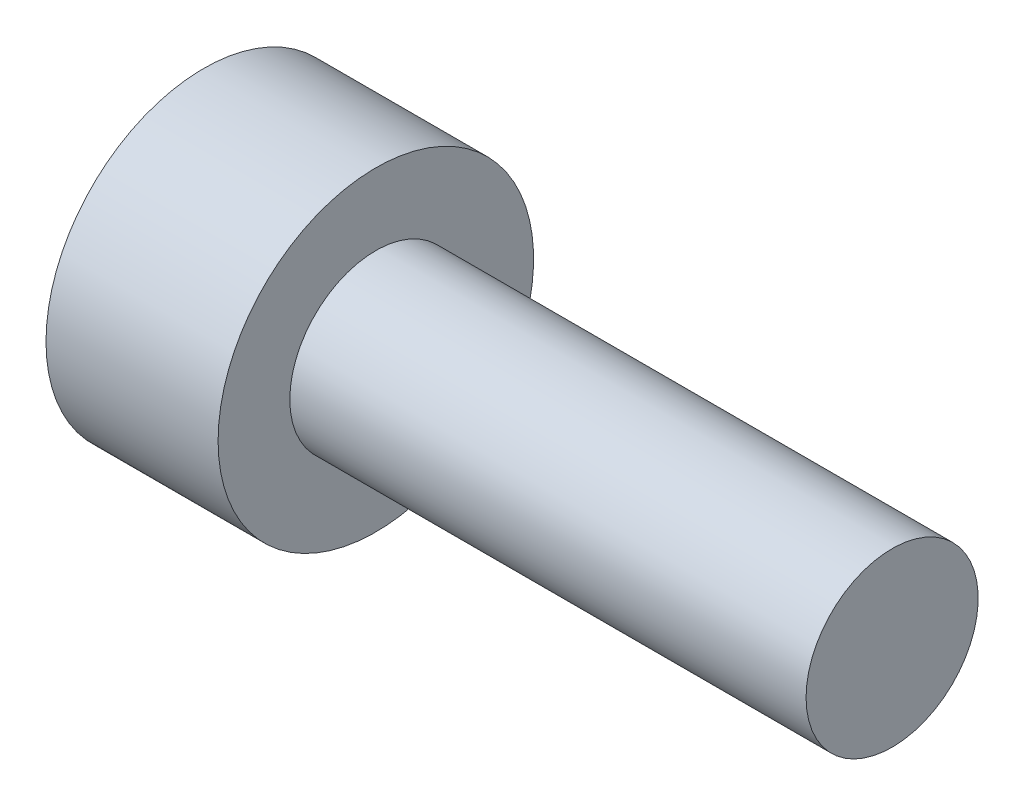
ISO-10303-21;
HEADER;
FILE_DESCRIPTION(('STEP AP214'),'2;1');
FILE_NAME('part.step','',(''),(''),'','','');
FILE_SCHEMA(('AUTOMOTIVE_DESIGN { 1 0 10303 214 1 1 1 1 }'));
ENDSEC;
DATA;
#1=APPLICATION_CONTEXT('core data for automotive mechanical design processes');
#2=APPLICATION_PROTOCOL_DEFINITION('international standard','automotive_design',2000,#1);
#3=PRODUCT_CONTEXT('',#1,'mechanical');
#4=PRODUCT('Part','Part','',(#3));
#5=PRODUCT_RELATED_PRODUCT_CATEGORY('part','',(#4));
#6=PRODUCT_DEFINITION_FORMATION('','',#4);
#7=PRODUCT_DEFINITION_CONTEXT('part definition',#1,'design');
#8=PRODUCT_DEFINITION('design','',#6,#7);
#9=PRODUCT_DEFINITION_SHAPE('','',#8);
#10=(LENGTH_UNIT() NAMED_UNIT(*) SI_UNIT(.MILLI.,.METRE.));
#11=(NAMED_UNIT(*) PLANE_ANGLE_UNIT() SI_UNIT($,.RADIAN.));
#12=(NAMED_UNIT(*) SI_UNIT($,.STERADIAN.) SOLID_ANGLE_UNIT());
#13=UNCERTAINTY_MEASURE_WITH_UNIT(LENGTH_MEASURE(1.E-05),#10,'distance_accuracy_value','');
#14=(GEOMETRIC_REPRESENTATION_CONTEXT(3) GLOBAL_UNCERTAINTY_ASSIGNED_CONTEXT((#13)) GLOBAL_UNIT_ASSIGNED_CONTEXT((#10,
#11,#12)) REPRESENTATION_CONTEXT('',''));
#15=CARTESIAN_POINT('',(0.,0.,0.));
#16=DIRECTION('',(0.,0.,1.));
#17=DIRECTION('',(1.,0.,0.));
#18=AXIS2_PLACEMENT_3D('',#15,#16,#17);
#19=CARTESIAN_POINT('',(-133.,2.75,0.));
#20=DIRECTION('',(1.,0.,0.));
#21=DIRECTION('',(0.,0.,-1.));
#22=AXIS2_PLACEMENT_3D('',#19,#20,#21);
#23=PLANE('',#22);
#24=CARTESIAN_POINT('',(-133.,0.,0.));
#25=DIRECTION('',(-1.,0.,0.));
#26=DIRECTION('',(0.,0.,1.));
#27=AXIS2_PLACEMENT_3D('',#24,#25,#26);
#28=CIRCLE('',#27,2.75);
#29=CARTESIAN_POINT('',(-133.,0.,2.75));
#30=VERTEX_POINT('',#29);
#31=EDGE_CURVE('E45',#30,#30,#28,.T.);
#32=ORIENTED_EDGE('',*,*,#31,.T.);
#33=EDGE_LOOP('',(#32));
#34=FACE_BOUND('',#33,.T.);
#35=ADVANCED_FACE('F31',(#34),#23,.F.);
#36=CARTESIAN_POINT('',(-121.,0.,0.));
#37=DIRECTION('',(-1.,0.,0.));
#38=DIRECTION('',(0.,0.,1.));
#39=AXIS2_PLACEMENT_3D('',#36,#37,#38);
#40=PLANE('',#39);
#41=CARTESIAN_POINT('',(-121.,0.,0.));
#42=DIRECTION('',(-1.,0.,0.));
#43=DIRECTION('',(0.,0.,1.));
#44=AXIS2_PLACEMENT_3D('',#41,#42,#43);
#45=CIRCLE('',#44,1.5);
#46=CARTESIAN_POINT('',(-121.,0.,1.5));
#47=VERTEX_POINT('',#46);
#48=EDGE_CURVE('E10',#47,#47,#45,.T.);
#49=ORIENTED_EDGE('',*,*,#48,.F.);
#50=EDGE_LOOP('',(#49));
#51=FACE_BOUND('',#50,.T.);
#52=ADVANCED_FACE('F65',(#51),#40,.F.);
#53=CARTESIAN_POINT('',(-110.,0.,0.));
#54=DIRECTION('',(-1.,0.,0.));
#55=DIRECTION('',(0.,0.,1.));
#56=AXIS2_PLACEMENT_3D('',#53,#54,#55);
#57=CYLINDRICAL_SURFACE('',#56,1.5);
#58=CARTESIAN_POINT('',(-130.,0.,0.));
#59=DIRECTION('',(-1.,0.,0.));
#60=DIRECTION('',(0.,0.,1.));
#61=AXIS2_PLACEMENT_3D('',#58,#59,#60);
#62=CIRCLE('',#61,1.5);
#63=CARTESIAN_POINT('',(-130.,0.,1.5));
#64=VERTEX_POINT('',#63);
#65=EDGE_CURVE('E37',#64,#64,#62,.T.);
#66=ORIENTED_EDGE('',*,*,#65,.F.);
#67=EDGE_LOOP('',(#66));
#68=FACE_BOUND('',#67,.T.);
#69=ORIENTED_EDGE('',*,*,#48,.T.);
#70=EDGE_LOOP('',(#69));
#71=FACE_BOUND('',#70,.T.);
#72=ADVANCED_FACE('F60',(#68,#71),#57,.T.);
#73=CARTESIAN_POINT('',(-130.,1.5,0.));
#74=DIRECTION('',(-1.,0.,0.));
#75=DIRECTION('',(0.,0.,1.));
#76=AXIS2_PLACEMENT_3D('',#73,#74,#75);
#77=PLANE('',#76);
#78=CARTESIAN_POINT('',(-130.,0.,0.));
#79=DIRECTION('',(-1.,0.,0.));
#80=DIRECTION('',(0.,0.,1.));
#81=AXIS2_PLACEMENT_3D('',#78,#79,#80);
#82=CIRCLE('',#81,2.75);
#83=CARTESIAN_POINT('',(-130.,0.,2.75));
#84=VERTEX_POINT('',#83);
#85=EDGE_CURVE('E41',#84,#84,#82,.T.);
#86=ORIENTED_EDGE('',*,*,#85,.F.);
#87=EDGE_LOOP('',(#86));
#88=FACE_BOUND('',#87,.T.);
#89=ORIENTED_EDGE('',*,*,#65,.T.);
#90=EDGE_LOOP('',(#89));
#91=FACE_BOUND('',#90,.T.);
#92=ADVANCED_FACE('F55',(#88,#91),#77,.F.);
#93=CARTESIAN_POINT('',(-110.,0.,0.));
#94=DIRECTION('',(-1.,0.,0.));
#95=DIRECTION('',(0.,0.,1.));
#96=AXIS2_PLACEMENT_3D('',#93,#94,#95);
#97=CYLINDRICAL_SURFACE('',#96,2.75);
#98=ORIENTED_EDGE('',*,*,#31,.F.);
#99=EDGE_LOOP('',(#98));
#100=FACE_BOUND('',#99,.T.);
#101=ORIENTED_EDGE('',*,*,#85,.T.);
#102=EDGE_LOOP('',(#101));
#103=FACE_BOUND('',#102,.T.);
#104=ADVANCED_FACE('F52',(#100,#103),#97,.T.);
#105=CLOSED_SHELL('',(#35,#52,#72,#92,#104));
#106=MANIFOLD_SOLID_BREP('B2',#105);
#107=ADVANCED_BREP_SHAPE_REPRESENTATION('',(#18,#106),#14);
#108=SHAPE_DEFINITION_REPRESENTATION(#9,#107);
ENDSEC;
END-ISO-10303-21;
